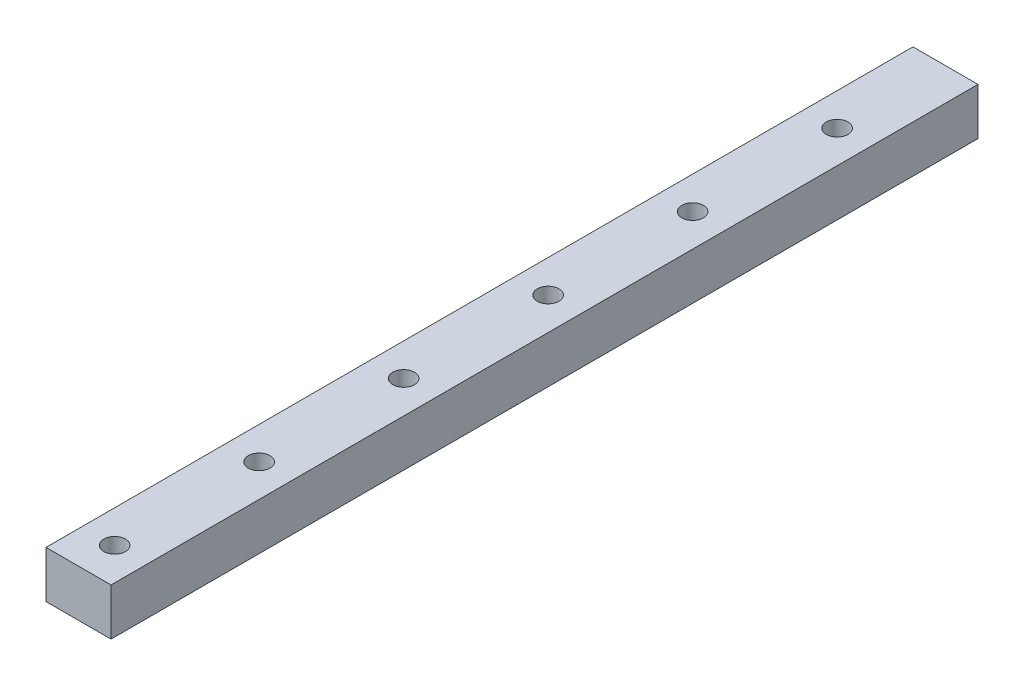
ISO-10303-21;
HEADER;
FILE_DESCRIPTION(('STEP AP214'),'2;1');
FILE_NAME('part.step','',(''),(''),'','','');
FILE_SCHEMA(('AUTOMOTIVE_DESIGN { 1 0 10303 214 1 1 1 1 }'));
ENDSEC;
DATA;
#1=APPLICATION_CONTEXT('core data for automotive mechanical design processes');
#2=APPLICATION_PROTOCOL_DEFINITION('international standard','automotive_design',2000,#1);
#3=PRODUCT_CONTEXT('',#1,'mechanical');
#4=PRODUCT('Part','Part','',(#3));
#5=PRODUCT_RELATED_PRODUCT_CATEGORY('part','',(#4));
#6=PRODUCT_DEFINITION_FORMATION('','',#4);
#7=PRODUCT_DEFINITION_CONTEXT('part definition',#1,'design');
#8=PRODUCT_DEFINITION('design','',#6,#7);
#9=PRODUCT_DEFINITION_SHAPE('','',#8);
#10=(LENGTH_UNIT() NAMED_UNIT(*) SI_UNIT(.MILLI.,.METRE.));
#11=(NAMED_UNIT(*) PLANE_ANGLE_UNIT() SI_UNIT($,.RADIAN.));
#12=(NAMED_UNIT(*) SI_UNIT($,.STERADIAN.) SOLID_ANGLE_UNIT());
#13=UNCERTAINTY_MEASURE_WITH_UNIT(LENGTH_MEASURE(1.E-05),#10,'distance_accuracy_value','');
#14=(GEOMETRIC_REPRESENTATION_CONTEXT(3) GLOBAL_UNCERTAINTY_ASSIGNED_CONTEXT((#13)) GLOBAL_UNIT_ASSIGNED_CONTEXT((#10,
#11,#12)) REPRESENTATION_CONTEXT('',''));
#15=CARTESIAN_POINT('',(0.,0.,0.));
#16=DIRECTION('',(0.,0.,1.));
#17=DIRECTION('',(1.,0.,0.));
#18=AXIS2_PLACEMENT_3D('',#15,#16,#17);
#19=CARTESIAN_POINT('',(0.,0.,120.));
#20=DIRECTION('',(1.,0.,0.));
#21=DIRECTION('',(0.,0.,-1.));
#22=AXIS2_PLACEMENT_3D('',#19,#20,#21);
#23=PLANE('',#22);
#24=DIRECTION('',(0.,-1.,0.));
#25=VECTOR('',#24,1.);
#26=CARTESIAN_POINT('',(0.,0.,0.));
#27=LINE('',#26,#25);
#28=CARTESIAN_POINT('',(0.,6.5,0.));
#29=VERTEX_POINT('',#28);
#30=CARTESIAN_POINT('',(0.,0.,0.));
#31=VERTEX_POINT('',#30);
#32=EDGE_CURVE('E98',#29,#31,#27,.T.);
#33=ORIENTED_EDGE('',*,*,#32,.T.);
#34=DIRECTION('',(0.,0.,-1.));
#35=VECTOR('',#34,1.);
#36=CARTESIAN_POINT('',(0.,0.,120.));
#37=LINE('',#36,#35);
#38=CARTESIAN_POINT('',(0.,0.,120.));
#39=VERTEX_POINT('',#38);
#40=EDGE_CURVE('E11',#39,#31,#37,.T.);
#41=ORIENTED_EDGE('',*,*,#40,.F.);
#42=DIRECTION('',(0.,-1.,0.));
#43=VECTOR('',#42,1.);
#44=CARTESIAN_POINT('',(0.,0.,120.));
#45=LINE('',#44,#43);
#46=CARTESIAN_POINT('',(0.,6.5,120.));
#47=VERTEX_POINT('',#46);
#48=EDGE_CURVE('E86',#47,#39,#45,.T.);
#49=ORIENTED_EDGE('',*,*,#48,.F.);
#50=DIRECTION('',(0.,0.,-1.));
#51=VECTOR('',#50,1.);
#52=CARTESIAN_POINT('',(0.,6.5,120.));
#53=LINE('',#52,#51);
#54=EDGE_CURVE('E94',#47,#29,#53,.T.);
#55=ORIENTED_EDGE('',*,*,#54,.T.);
#56=EDGE_LOOP('',(#33,#41,#49,#55));
#57=FACE_BOUND('',#56,.T.);
#58=ADVANCED_FACE('F35',(#57),#23,.F.);
#59=CARTESIAN_POINT('',(0.,0.,120.));
#60=DIRECTION('',(0.,1.,0.));
#61=DIRECTION('',(0.,0.,1.));
#62=AXIS2_PLACEMENT_3D('',#59,#60,#61);
#63=PLANE('',#62);
#64=CARTESIAN_POINT('',(4.5,0.,115.));
#65=DIRECTION('',(0.,1.,0.));
#66=DIRECTION('',(0.,0.,1.));
#67=AXIS2_PLACEMENT_3D('',#64,#65,#66);
#68=CIRCLE('',#67,1.5);
#69=CARTESIAN_POINT('',(4.5,0.,116.5));
#70=VERTEX_POINT('',#69);
#71=EDGE_CURVE('E101',#70,#70,#68,.T.);
#72=ORIENTED_EDGE('',*,*,#71,.T.);
#73=EDGE_LOOP('',(#72));
#74=FACE_BOUND('',#73,.T.);
#75=CARTESIAN_POINT('',(4.49999999999993,0.,95.));
#76=DIRECTION('',(0.,1.,0.));
#77=DIRECTION('',(0.,0.,1.));
#78=AXIS2_PLACEMENT_3D('',#75,#76,#77);
#79=CIRCLE('',#78,1.5);
#80=CARTESIAN_POINT('',(4.49999999999993,0.,96.5));
#81=VERTEX_POINT('',#80);
#82=EDGE_CURVE('E114',#81,#81,#79,.T.);
#83=ORIENTED_EDGE('',*,*,#82,.T.);
#84=EDGE_LOOP('',(#83));
#85=FACE_BOUND('',#84,.T.);
#86=CARTESIAN_POINT('',(4.49999999999986,0.,75.));
#87=DIRECTION('',(0.,1.,0.));
#88=DIRECTION('',(0.,0.,1.));
#89=AXIS2_PLACEMENT_3D('',#86,#87,#88);
#90=CIRCLE('',#89,1.5);
#91=CARTESIAN_POINT('',(4.49999999999986,0.,76.5));
#92=VERTEX_POINT('',#91);
#93=EDGE_CURVE('E117',#92,#92,#90,.T.);
#94=ORIENTED_EDGE('',*,*,#93,.T.);
#95=EDGE_LOOP('',(#94));
#96=FACE_BOUND('',#95,.T.);
#97=CARTESIAN_POINT('',(4.49999999999979,0.,55.));
#98=DIRECTION('',(0.,1.,0.));
#99=DIRECTION('',(0.,0.,1.));
#100=AXIS2_PLACEMENT_3D('',#97,#98,#99);
#101=CIRCLE('',#100,1.5);
#102=CARTESIAN_POINT('',(4.49999999999979,0.,56.5));
#103=VERTEX_POINT('',#102);
#104=EDGE_CURVE('E120',#103,#103,#101,.T.);
#105=ORIENTED_EDGE('',*,*,#104,.T.);
#106=EDGE_LOOP('',(#105));
#107=FACE_BOUND('',#106,.T.);
#108=CARTESIAN_POINT('',(4.49999999999973,0.,35.));
#109=DIRECTION('',(0.,1.,0.));
#110=DIRECTION('',(0.,0.,1.));
#111=AXIS2_PLACEMENT_3D('',#108,#109,#110);
#112=CIRCLE('',#111,1.5);
#113=CARTESIAN_POINT('',(4.49999999999973,0.,36.5));
#114=VERTEX_POINT('',#113);
#115=EDGE_CURVE('E123',#114,#114,#112,.T.);
#116=ORIENTED_EDGE('',*,*,#115,.T.);
#117=EDGE_LOOP('',(#116));
#118=FACE_BOUND('',#117,.T.);
#119=CARTESIAN_POINT('',(4.49999999999966,0.,15.));
#120=DIRECTION('',(0.,1.,0.));
#121=DIRECTION('',(0.,0.,1.));
#122=AXIS2_PLACEMENT_3D('',#119,#120,#121);
#123=CIRCLE('',#122,1.5);
#124=CARTESIAN_POINT('',(4.49999999999966,0.,16.5));
#125=VERTEX_POINT('',#124);
#126=EDGE_CURVE('E126',#125,#125,#123,.T.);
#127=ORIENTED_EDGE('',*,*,#126,.T.);
#128=EDGE_LOOP('',(#127));
#129=FACE_BOUND('',#128,.T.);
#130=DIRECTION('',(1.,0.,0.));
#131=VECTOR('',#130,1.);
#132=CARTESIAN_POINT('',(0.,0.,0.));
#133=LINE('',#132,#131);
#134=CARTESIAN_POINT('',(9.,0.,0.));
#135=VERTEX_POINT('',#134);
#136=EDGE_CURVE('E90',#31,#135,#133,.T.);
#137=ORIENTED_EDGE('',*,*,#136,.T.);
#138=DIRECTION('',(0.,0.,-1.));
#139=VECTOR('',#138,1.);
#140=CARTESIAN_POINT('',(9.,0.,120.));
#141=LINE('',#140,#139);
#142=CARTESIAN_POINT('',(9.,0.,120.));
#143=VERTEX_POINT('',#142);
#144=EDGE_CURVE('E43',#143,#135,#141,.T.);
#145=ORIENTED_EDGE('',*,*,#144,.F.);
#146=DIRECTION('',(1.,0.,0.));
#147=VECTOR('',#146,1.);
#148=CARTESIAN_POINT('',(0.,0.,120.));
#149=LINE('',#148,#147);
#150=EDGE_CURVE('E81',#39,#143,#149,.T.);
#151=ORIENTED_EDGE('',*,*,#150,.F.);
#152=ORIENTED_EDGE('',*,*,#40,.T.);
#153=EDGE_LOOP('',(#137,#145,#151,#152));
#154=FACE_BOUND('',#153,.T.);
#155=ADVANCED_FACE('F89',(#74,#85,#96,#107,#118,#129,#154),#63,.F.);
#156=CARTESIAN_POINT('',(9.,0.,120.));
#157=DIRECTION('',(-1.,0.,0.));
#158=DIRECTION('',(0.,0.,1.));
#159=AXIS2_PLACEMENT_3D('',#156,#157,#158);
#160=PLANE('',#159);
#161=DIRECTION('',(0.,1.,0.));
#162=VECTOR('',#161,1.);
#163=CARTESIAN_POINT('',(9.,0.,0.));
#164=LINE('',#163,#162);
#165=CARTESIAN_POINT('',(9.,6.5,0.));
#166=VERTEX_POINT('',#165);
#167=EDGE_CURVE('E68',#135,#166,#164,.T.);
#168=ORIENTED_EDGE('',*,*,#167,.T.);
#169=DIRECTION('',(0.,0.,-1.));
#170=VECTOR('',#169,1.);
#171=CARTESIAN_POINT('',(9.,6.5,120.));
#172=LINE('',#171,#170);
#173=CARTESIAN_POINT('',(9.,6.5,120.));
#174=VERTEX_POINT('',#173);
#175=EDGE_CURVE('E91',#174,#166,#172,.T.);
#176=ORIENTED_EDGE('',*,*,#175,.F.);
#177=DIRECTION('',(0.,1.,0.));
#178=VECTOR('',#177,1.);
#179=CARTESIAN_POINT('',(9.,0.,120.));
#180=LINE('',#179,#178);
#181=EDGE_CURVE('E84',#143,#174,#180,.T.);
#182=ORIENTED_EDGE('',*,*,#181,.F.);
#183=ORIENTED_EDGE('',*,*,#144,.T.);
#184=EDGE_LOOP('',(#168,#176,#182,#183));
#185=FACE_BOUND('',#184,.T.);
#186=ADVANCED_FACE('F92',(#185),#160,.F.);
#187=CARTESIAN_POINT('',(0.,6.5,120.));
#188=DIRECTION('',(0.,-1.,0.));
#189=DIRECTION('',(0.,0.,-1.));
#190=AXIS2_PLACEMENT_3D('',#187,#188,#189);
#191=PLANE('',#190);
#192=CARTESIAN_POINT('',(4.5,6.5,115.));
#193=DIRECTION('',(0.,1.,0.));
#194=DIRECTION('',(0.,0.,1.));
#195=AXIS2_PLACEMENT_3D('',#192,#193,#194);
#196=CIRCLE('',#195,1.5);
#197=CARTESIAN_POINT('',(4.5,6.5,116.5));
#198=VERTEX_POINT('',#197);
#199=EDGE_CURVE('E129',#198,#198,#196,.T.);
#200=ORIENTED_EDGE('',*,*,#199,.F.);
#201=EDGE_LOOP('',(#200));
#202=FACE_BOUND('',#201,.T.);
#203=CARTESIAN_POINT('',(4.49999999999993,6.5,95.));
#204=DIRECTION('',(0.,1.,0.));
#205=DIRECTION('',(0.,0.,1.));
#206=AXIS2_PLACEMENT_3D('',#203,#204,#205);
#207=CIRCLE('',#206,1.5);
#208=CARTESIAN_POINT('',(4.49999999999993,6.5,96.5));
#209=VERTEX_POINT('',#208);
#210=EDGE_CURVE('E142',#209,#209,#207,.T.);
#211=ORIENTED_EDGE('',*,*,#210,.F.);
#212=EDGE_LOOP('',(#211));
#213=FACE_BOUND('',#212,.T.);
#214=CARTESIAN_POINT('',(4.49999999999986,6.5,75.));
#215=DIRECTION('',(0.,1.,0.));
#216=DIRECTION('',(0.,0.,1.));
#217=AXIS2_PLACEMENT_3D('',#214,#215,#216);
#218=CIRCLE('',#217,1.5);
#219=CARTESIAN_POINT('',(4.49999999999986,6.5,76.5));
#220=VERTEX_POINT('',#219);
#221=EDGE_CURVE('E139',#220,#220,#218,.T.);
#222=ORIENTED_EDGE('',*,*,#221,.F.);
#223=EDGE_LOOP('',(#222));
#224=FACE_BOUND('',#223,.T.);
#225=CARTESIAN_POINT('',(4.49999999999979,6.5,55.));
#226=DIRECTION('',(0.,1.,0.));
#227=DIRECTION('',(0.,0.,1.));
#228=AXIS2_PLACEMENT_3D('',#225,#226,#227);
#229=CIRCLE('',#228,1.5);
#230=CARTESIAN_POINT('',(4.49999999999979,6.5,56.5));
#231=VERTEX_POINT('',#230);
#232=EDGE_CURVE('E136',#231,#231,#229,.T.);
#233=ORIENTED_EDGE('',*,*,#232,.F.);
#234=EDGE_LOOP('',(#233));
#235=FACE_BOUND('',#234,.T.);
#236=CARTESIAN_POINT('',(4.49999999999973,6.5,35.));
#237=DIRECTION('',(0.,1.,0.));
#238=DIRECTION('',(0.,0.,1.));
#239=AXIS2_PLACEMENT_3D('',#236,#237,#238);
#240=CIRCLE('',#239,1.5);
#241=CARTESIAN_POINT('',(4.49999999999973,6.5,36.5));
#242=VERTEX_POINT('',#241);
#243=EDGE_CURVE('E133',#242,#242,#240,.T.);
#244=ORIENTED_EDGE('',*,*,#243,.F.);
#245=EDGE_LOOP('',(#244));
#246=FACE_BOUND('',#245,.T.);
#247=CARTESIAN_POINT('',(4.49999999999966,6.5,15.));
#248=DIRECTION('',(0.,1.,0.));
#249=DIRECTION('',(0.,0.,1.));
#250=AXIS2_PLACEMENT_3D('',#247,#248,#249);
#251=CIRCLE('',#250,1.5);
#252=CARTESIAN_POINT('',(4.49999999999966,6.5,16.5));
#253=VERTEX_POINT('',#252);
#254=EDGE_CURVE('E130',#253,#253,#251,.T.);
#255=ORIENTED_EDGE('',*,*,#254,.F.);
#256=EDGE_LOOP('',(#255));
#257=FACE_BOUND('',#256,.T.);
#258=DIRECTION('',(-1.,0.,0.));
#259=VECTOR('',#258,1.);
#260=CARTESIAN_POINT('',(0.,6.5,0.));
#261=LINE('',#260,#259);
#262=EDGE_CURVE('E74',#166,#29,#261,.T.);
#263=ORIENTED_EDGE('',*,*,#262,.T.);
#264=ORIENTED_EDGE('',*,*,#54,.F.);
#265=DIRECTION('',(-1.,0.,0.));
#266=VECTOR('',#265,1.);
#267=CARTESIAN_POINT('',(0.,6.5,120.));
#268=LINE('',#267,#266);
#269=EDGE_CURVE('E51',#174,#47,#268,.T.);
#270=ORIENTED_EDGE('',*,*,#269,.F.);
#271=ORIENTED_EDGE('',*,*,#175,.T.);
#272=EDGE_LOOP('',(#263,#264,#270,#271));
#273=FACE_BOUND('',#272,.T.);
#274=ADVANCED_FACE('F106',(#202,#213,#224,#235,#246,#257,#273),#191,.F.);
#275=CARTESIAN_POINT('',(0.,0.,120.));
#276=DIRECTION('',(0.,0.,-1.));
#277=DIRECTION('',(-1.,0.,0.));
#278=AXIS2_PLACEMENT_3D('',#275,#276,#277);
#279=PLANE('',#278);
#280=ORIENTED_EDGE('',*,*,#48,.T.);
#281=ORIENTED_EDGE('',*,*,#150,.T.);
#282=ORIENTED_EDGE('',*,*,#181,.T.);
#283=ORIENTED_EDGE('',*,*,#269,.T.);
#284=EDGE_LOOP('',(#280,#281,#282,#283));
#285=FACE_BOUND('',#284,.T.);
#286=ADVANCED_FACE('F82',(#285),#279,.F.);
#287=CARTESIAN_POINT('',(0.,0.,0.));
#288=DIRECTION('',(0.,0.,-1.));
#289=DIRECTION('',(-1.,0.,0.));
#290=AXIS2_PLACEMENT_3D('',#287,#288,#289);
#291=PLANE('',#290);
#292=ORIENTED_EDGE('',*,*,#32,.F.);
#293=ORIENTED_EDGE('',*,*,#262,.F.);
#294=ORIENTED_EDGE('',*,*,#167,.F.);
#295=ORIENTED_EDGE('',*,*,#136,.F.);
#296=EDGE_LOOP('',(#292,#293,#294,#295));
#297=FACE_BOUND('',#296,.T.);
#298=ADVANCED_FACE('F109',(#297),#291,.T.);
#299=CARTESIAN_POINT('',(4.49999999999966,-93.5,15.));
#300=DIRECTION('',(0.,1.,0.));
#301=DIRECTION('',(0.,0.,1.));
#302=AXIS2_PLACEMENT_3D('',#299,#300,#301);
#303=CYLINDRICAL_SURFACE('',#302,1.5);
#304=ORIENTED_EDGE('',*,*,#254,.T.);
#305=EDGE_LOOP('',(#304));
#306=FACE_BOUND('',#305,.T.);
#307=ORIENTED_EDGE('',*,*,#126,.F.);
#308=EDGE_LOOP('',(#307));
#309=FACE_BOUND('',#308,.T.);
#310=ADVANCED_FACE('F164',(#306,#309),#303,.F.);
#311=CARTESIAN_POINT('',(4.49999999999973,-93.5,35.));
#312=DIRECTION('',(0.,1.,0.));
#313=DIRECTION('',(0.,0.,1.));
#314=AXIS2_PLACEMENT_3D('',#311,#312,#313);
#315=CYLINDRICAL_SURFACE('',#314,1.5);
#316=ORIENTED_EDGE('',*,*,#243,.T.);
#317=EDGE_LOOP('',(#316));
#318=FACE_BOUND('',#317,.T.);
#319=ORIENTED_EDGE('',*,*,#115,.F.);
#320=EDGE_LOOP('',(#319));
#321=FACE_BOUND('',#320,.T.);
#322=ADVANCED_FACE('F167',(#318,#321),#315,.F.);
#323=CARTESIAN_POINT('',(4.49999999999979,-93.5,55.));
#324=DIRECTION('',(0.,1.,0.));
#325=DIRECTION('',(0.,0.,1.));
#326=AXIS2_PLACEMENT_3D('',#323,#324,#325);
#327=CYLINDRICAL_SURFACE('',#326,1.5);
#328=ORIENTED_EDGE('',*,*,#232,.T.);
#329=EDGE_LOOP('',(#328));
#330=FACE_BOUND('',#329,.T.);
#331=ORIENTED_EDGE('',*,*,#104,.F.);
#332=EDGE_LOOP('',(#331));
#333=FACE_BOUND('',#332,.T.);
#334=ADVANCED_FACE('F186',(#330,#333),#327,.F.);
#335=CARTESIAN_POINT('',(4.49999999999986,-93.5,75.));
#336=DIRECTION('',(0.,1.,0.));
#337=DIRECTION('',(0.,0.,1.));
#338=AXIS2_PLACEMENT_3D('',#335,#336,#337);
#339=CYLINDRICAL_SURFACE('',#338,1.5);
#340=ORIENTED_EDGE('',*,*,#221,.T.);
#341=EDGE_LOOP('',(#340));
#342=FACE_BOUND('',#341,.T.);
#343=ORIENTED_EDGE('',*,*,#93,.F.);
#344=EDGE_LOOP('',(#343));
#345=FACE_BOUND('',#344,.T.);
#346=ADVANCED_FACE('F190',(#342,#345),#339,.F.);
#347=CARTESIAN_POINT('',(4.49999999999993,-93.5,95.));
#348=DIRECTION('',(0.,1.,0.));
#349=DIRECTION('',(0.,0.,1.));
#350=AXIS2_PLACEMENT_3D('',#347,#348,#349);
#351=CYLINDRICAL_SURFACE('',#350,1.5);
#352=ORIENTED_EDGE('',*,*,#210,.T.);
#353=EDGE_LOOP('',(#352));
#354=FACE_BOUND('',#353,.T.);
#355=ORIENTED_EDGE('',*,*,#82,.F.);
#356=EDGE_LOOP('',(#355));
#357=FACE_BOUND('',#356,.T.);
#358=ADVANCED_FACE('F194',(#354,#357),#351,.F.);
#359=CARTESIAN_POINT('',(4.5,-93.5,115.));
#360=DIRECTION('',(0.,1.,0.));
#361=DIRECTION('',(0.,0.,1.));
#362=AXIS2_PLACEMENT_3D('',#359,#360,#361);
#363=CYLINDRICAL_SURFACE('',#362,1.5);
#364=ORIENTED_EDGE('',*,*,#199,.T.);
#365=EDGE_LOOP('',(#364));
#366=FACE_BOUND('',#365,.T.);
#367=ORIENTED_EDGE('',*,*,#71,.F.);
#368=EDGE_LOOP('',(#367));
#369=FACE_BOUND('',#368,.T.);
#370=ADVANCED_FACE('F148',(#366,#369),#363,.F.);
#371=CLOSED_SHELL('',(#58,#155,#186,#274,#286,#298,#310,#322,#334,#346,#358,#370));
#372=MANIFOLD_SOLID_BREP('B2',#371);
#373=ADVANCED_BREP_SHAPE_REPRESENTATION('',(#18,#372),#14);
#374=SHAPE_DEFINITION_REPRESENTATION(#9,#373);
ENDSEC;
END-ISO-10303-21;
